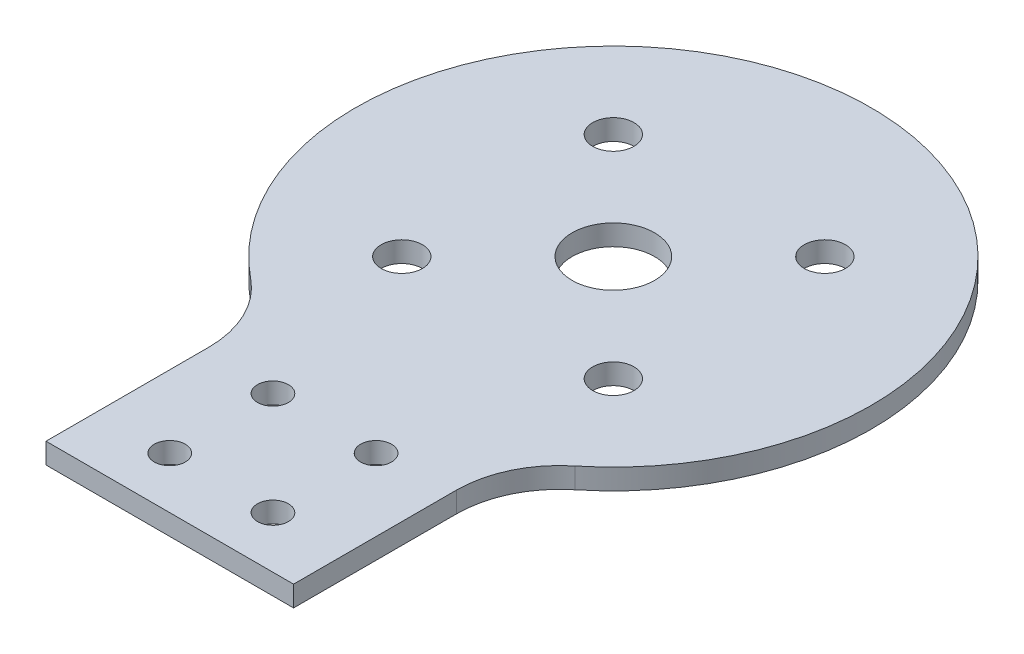
ISO-10303-21;
HEADER;
FILE_DESCRIPTION(('STEP AP214'),'2;1');
FILE_NAME('part.step','',(''),(''),'','','');
FILE_SCHEMA(('AUTOMOTIVE_DESIGN { 1 0 10303 214 1 1 1 1 }'));
ENDSEC;
DATA;
#1=APPLICATION_CONTEXT('core data for automotive mechanical design processes');
#2=APPLICATION_PROTOCOL_DEFINITION('international standard','automotive_design',2000,#1);
#3=PRODUCT_CONTEXT('',#1,'mechanical');
#4=PRODUCT('Part','Part','',(#3));
#5=PRODUCT_RELATED_PRODUCT_CATEGORY('part','',(#4));
#6=PRODUCT_DEFINITION_FORMATION('','',#4);
#7=PRODUCT_DEFINITION_CONTEXT('part definition',#1,'design');
#8=PRODUCT_DEFINITION('design','',#6,#7);
#9=PRODUCT_DEFINITION_SHAPE('','',#8);
#10=(LENGTH_UNIT() NAMED_UNIT(*) SI_UNIT(.MILLI.,.METRE.));
#11=(NAMED_UNIT(*) PLANE_ANGLE_UNIT() SI_UNIT($,.RADIAN.));
#12=(NAMED_UNIT(*) SI_UNIT($,.STERADIAN.) SOLID_ANGLE_UNIT());
#13=UNCERTAINTY_MEASURE_WITH_UNIT(LENGTH_MEASURE(1.E-05),#10,'distance_accuracy_value','');
#14=(GEOMETRIC_REPRESENTATION_CONTEXT(3) GLOBAL_UNCERTAINTY_ASSIGNED_CONTEXT((#13)) GLOBAL_UNIT_ASSIGNED_CONTEXT((#10,
#11,#12)) REPRESENTATION_CONTEXT('',''));
#15=CARTESIAN_POINT('',(0.,0.,0.));
#16=DIRECTION('',(0.,0.,1.));
#17=DIRECTION('',(1.,0.,0.));
#18=AXIS2_PLACEMENT_3D('',#15,#16,#17);
#19=CARTESIAN_POINT('',(0.,2.,0.));
#20=DIRECTION('',(0.,1.,0.));
#21=DIRECTION('',(0.,0.,1.));
#22=AXIS2_PLACEMENT_3D('',#19,#20,#21);
#23=PLANE('',#22);
#24=CARTESIAN_POINT('',(5.,2.,38.));
#25=DIRECTION('',(0.,1.,0.));
#26=DIRECTION('',(0.,0.,1.));
#27=AXIS2_PLACEMENT_3D('',#24,#25,#26);
#28=CIRCLE('',#27,1.5);
#29=CARTESIAN_POINT('',(5.,2.,39.5));
#30=VERTEX_POINT('',#29);
#31=EDGE_CURVE('E295',#30,#30,#28,.T.);
#32=ORIENTED_EDGE('',*,*,#31,.F.);
#33=EDGE_LOOP('',(#32));
#34=FACE_BOUND('',#33,.T.);
#35=CARTESIAN_POINT('',(-5.,2.,28.));
#36=DIRECTION('',(0.,1.,0.));
#37=DIRECTION('',(0.,0.,1.));
#38=AXIS2_PLACEMENT_3D('',#35,#36,#37);
#39=CIRCLE('',#38,1.5);
#40=CARTESIAN_POINT('',(-5.,2.,29.5));
#41=VERTEX_POINT('',#40);
#42=EDGE_CURVE('E291',#41,#41,#39,.T.);
#43=ORIENTED_EDGE('',*,*,#42,.F.);
#44=EDGE_LOOP('',(#43));
#45=FACE_BOUND('',#44,.T.);
#46=CARTESIAN_POINT('',(-5.,2.,38.));
#47=DIRECTION('',(0.,1.,0.));
#48=DIRECTION('',(0.,0.,1.));
#49=AXIS2_PLACEMENT_3D('',#46,#47,#48);
#50=CIRCLE('',#49,1.5);
#51=CARTESIAN_POINT('',(-5.,2.,39.5));
#52=VERTEX_POINT('',#51);
#53=EDGE_CURVE('E283',#52,#52,#50,.T.);
#54=ORIENTED_EDGE('',*,*,#53,.F.);
#55=EDGE_LOOP('',(#54));
#56=FACE_BOUND('',#55,.T.);
#57=CARTESIAN_POINT('',(5.,2.,28.));
#58=DIRECTION('',(0.,1.,0.));
#59=DIRECTION('',(0.,0.,1.));
#60=AXIS2_PLACEMENT_3D('',#57,#58,#59);
#61=CIRCLE('',#60,1.5);
#62=CARTESIAN_POINT('',(5.,2.,29.5));
#63=VERTEX_POINT('',#62);
#64=EDGE_CURVE('E299',#63,#63,#61,.T.);
#65=ORIENTED_EDGE('',*,*,#64,.F.);
#66=EDGE_LOOP('',(#65));
#67=FACE_BOUND('',#66,.T.);
#68=DIRECTION('',(0.,0.,-1.));
#69=VECTOR('',#68,1.);
#70=CARTESIAN_POINT('',(12.,2.,43.));
#71=LINE('',#70,#69);
#72=CARTESIAN_POINT('',(12.,2.,43.));
#73=VERTEX_POINT('',#72);
#74=CARTESIAN_POINT('',(12.,2.,27.2213151776324));
#75=VERTEX_POINT('',#74);
#76=EDGE_CURVE('E124',#73,#75,#71,.T.);
#77=ORIENTED_EDGE('',*,*,#76,.T.);
#78=CARTESIAN_POINT('',(22.,2.,27.2213151776324));
#79=DIRECTION('',(0.,1.,0.));
#80=DIRECTION('',(0.,0.,1.));
#81=AXIS2_PLACEMENT_3D('',#78,#79,#80);
#82=CIRCLE('',#81,10.);
#83=CARTESIAN_POINT('',(15.7142857142857,2.,19.4437965554517));
#84=VERTEX_POINT('',#83);
#85=EDGE_CURVE('E196',#75,#84,#82,.F.);
#86=ORIENTED_EDGE('',*,*,#85,.T.);
#87=CARTESIAN_POINT('',(0.,2.,0.));
#88=DIRECTION('',(0.,1.,0.));
#89=DIRECTION('',(0.,0.,1.));
#90=AXIS2_PLACEMENT_3D('',#87,#88,#89);
#91=CIRCLE('',#90,25.);
#92=CARTESIAN_POINT('',(-15.7142857142857,2.,19.4437965554517));
#93=VERTEX_POINT('',#92);
#94=EDGE_CURVE('E165',#84,#93,#91,.T.);
#95=ORIENTED_EDGE('',*,*,#94,.T.);
#96=CARTESIAN_POINT('',(-22.,2.,27.2213151776324));
#97=DIRECTION('',(0.,1.,0.));
#98=DIRECTION('',(0.,0.,1.));
#99=AXIS2_PLACEMENT_3D('',#96,#97,#98);
#100=CIRCLE('',#99,10.);
#101=CARTESIAN_POINT('',(-12.,2.,27.2213151776324));
#102=VERTEX_POINT('',#101);
#103=EDGE_CURVE('E54',#93,#102,#100,.F.);
#104=ORIENTED_EDGE('',*,*,#103,.T.);
#105=DIRECTION('',(0.,0.,1.));
#106=VECTOR('',#105,1.);
#107=CARTESIAN_POINT('',(-12.,2.,21.9317121994613));
#108=LINE('',#107,#106);
#109=CARTESIAN_POINT('',(-12.,2.,43.));
#110=VERTEX_POINT('',#109);
#111=EDGE_CURVE('E128',#102,#110,#108,.T.);
#112=ORIENTED_EDGE('',*,*,#111,.T.);
#113=DIRECTION('',(1.,0.,0.));
#114=VECTOR('',#113,1.);
#115=CARTESIAN_POINT('',(-12.,2.,43.));
#116=LINE('',#115,#114);
#117=EDGE_CURVE('E111',#110,#73,#116,.T.);
#118=ORIENTED_EDGE('',*,*,#117,.T.);
#119=EDGE_LOOP('',(#77,#86,#95,#104,#112,#118));
#120=FACE_BOUND('',#119,.T.);
#121=CARTESIAN_POINT('',(10.2530483272049,2.,10.2530483272049));
#122=DIRECTION('',(0.,1.,0.));
#123=DIRECTION('',(0.,0.,1.));
#124=AXIS2_PLACEMENT_3D('',#121,#122,#123);
#125=CIRCLE('',#124,2.);
#126=CARTESIAN_POINT('',(10.2530483272049,2.,12.2530483272049));
#127=VERTEX_POINT('',#126);
#128=EDGE_CURVE('E135',#127,#127,#125,.T.);
#129=ORIENTED_EDGE('',*,*,#128,.F.);
#130=EDGE_LOOP('',(#129));
#131=FACE_BOUND('',#130,.T.);
#132=CARTESIAN_POINT('',(-10.2530483272049,2.,10.2530483272049));
#133=DIRECTION('',(0.,1.,0.));
#134=DIRECTION('',(0.,0.,1.));
#135=AXIS2_PLACEMENT_3D('',#132,#133,#134);
#136=CIRCLE('',#135,2.);
#137=CARTESIAN_POINT('',(-10.2530483272049,2.,12.2530483272049));
#138=VERTEX_POINT('',#137);
#139=EDGE_CURVE('E141',#138,#138,#136,.T.);
#140=ORIENTED_EDGE('',*,*,#139,.F.);
#141=EDGE_LOOP('',(#140));
#142=FACE_BOUND('',#141,.T.);
#143=CARTESIAN_POINT('',(10.2530483272049,2.,-10.2530483272049));
#144=DIRECTION('',(0.,1.,0.));
#145=DIRECTION('',(0.,0.,1.));
#146=AXIS2_PLACEMENT_3D('',#143,#144,#145);
#147=CIRCLE('',#146,2.);
#148=CARTESIAN_POINT('',(10.2530483272049,2.,-8.25304832720494));
#149=VERTEX_POINT('',#148);
#150=EDGE_CURVE('E149',#149,#149,#147,.T.);
#151=ORIENTED_EDGE('',*,*,#150,.F.);
#152=EDGE_LOOP('',(#151));
#153=FACE_BOUND('',#152,.T.);
#154=CARTESIAN_POINT('',(-10.2530483272049,2.,-10.2530483272049));
#155=DIRECTION('',(0.,1.,0.));
#156=DIRECTION('',(0.,0.,1.));
#157=AXIS2_PLACEMENT_3D('',#154,#155,#156);
#158=CIRCLE('',#157,2.);
#159=CARTESIAN_POINT('',(-10.2530483272049,2.,-8.25304832720495));
#160=VERTEX_POINT('',#159);
#161=EDGE_CURVE('E157',#160,#160,#158,.T.);
#162=ORIENTED_EDGE('',*,*,#161,.F.);
#163=EDGE_LOOP('',(#162));
#164=FACE_BOUND('',#163,.T.);
#165=CARTESIAN_POINT('',(0.,2.,0.));
#166=DIRECTION('',(0.,1.,0.));
#167=DIRECTION('',(0.,0.,1.));
#168=AXIS2_PLACEMENT_3D('',#165,#166,#167);
#169=CIRCLE('',#168,4.);
#170=CARTESIAN_POINT('',(0.,2.,4.));
#171=VERTEX_POINT('',#170);
#172=EDGE_CURVE('E176',#171,#171,#169,.T.);
#173=ORIENTED_EDGE('',*,*,#172,.F.);
#174=EDGE_LOOP('',(#173));
#175=FACE_BOUND('',#174,.T.);
#176=ADVANCED_FACE('F45',(#34,#45,#56,#67,#120,#131,#142,#153,#164,#175),#23,.T.);
#177=CARTESIAN_POINT('',(0.,0.,0.));
#178=DIRECTION('',(0.,1.,0.));
#179=DIRECTION('',(0.,0.,1.));
#180=AXIS2_PLACEMENT_3D('',#177,#178,#179);
#181=PLANE('',#180);
#182=CARTESIAN_POINT('',(5.,0.,38.));
#183=DIRECTION('',(0.,1.,0.));
#184=DIRECTION('',(0.,0.,1.));
#185=AXIS2_PLACEMENT_3D('',#182,#183,#184);
#186=CIRCLE('',#185,1.5);
#187=CARTESIAN_POINT('',(5.,0.,39.5));
#188=VERTEX_POINT('',#187);
#189=EDGE_CURVE('E300',#188,#188,#186,.T.);
#190=ORIENTED_EDGE('',*,*,#189,.T.);
#191=EDGE_LOOP('',(#190));
#192=FACE_BOUND('',#191,.T.);
#193=CARTESIAN_POINT('',(-5.,0.,28.));
#194=DIRECTION('',(0.,1.,0.));
#195=DIRECTION('',(0.,0.,1.));
#196=AXIS2_PLACEMENT_3D('',#193,#194,#195);
#197=CIRCLE('',#196,1.5);
#198=CARTESIAN_POINT('',(-5.,0.,29.5));
#199=VERTEX_POINT('',#198);
#200=EDGE_CURVE('E286',#199,#199,#197,.T.);
#201=ORIENTED_EDGE('',*,*,#200,.T.);
#202=EDGE_LOOP('',(#201));
#203=FACE_BOUND('',#202,.T.);
#204=CARTESIAN_POINT('',(-5.,0.,38.));
#205=DIRECTION('',(0.,1.,0.));
#206=DIRECTION('',(0.,0.,1.));
#207=AXIS2_PLACEMENT_3D('',#204,#205,#206);
#208=CIRCLE('',#207,1.5);
#209=CARTESIAN_POINT('',(-5.,0.,39.5));
#210=VERTEX_POINT('',#209);
#211=EDGE_CURVE('E280',#210,#210,#208,.T.);
#212=ORIENTED_EDGE('',*,*,#211,.T.);
#213=EDGE_LOOP('',(#212));
#214=FACE_BOUND('',#213,.T.);
#215=CARTESIAN_POINT('',(5.,0.,28.));
#216=DIRECTION('',(0.,1.,0.));
#217=DIRECTION('',(0.,0.,1.));
#218=AXIS2_PLACEMENT_3D('',#215,#216,#217);
#219=CIRCLE('',#218,1.5);
#220=CARTESIAN_POINT('',(5.,0.,29.5));
#221=VERTEX_POINT('',#220);
#222=EDGE_CURVE('E129',#221,#221,#219,.T.);
#223=ORIENTED_EDGE('',*,*,#222,.T.);
#224=EDGE_LOOP('',(#223));
#225=FACE_BOUND('',#224,.T.);
#226=CARTESIAN_POINT('',(10.2530483272049,0.,10.2530483272049));
#227=DIRECTION('',(0.,1.,0.));
#228=DIRECTION('',(0.,0.,1.));
#229=AXIS2_PLACEMENT_3D('',#226,#227,#228);
#230=CIRCLE('',#229,2.);
#231=CARTESIAN_POINT('',(10.2530483272049,0.,12.2530483272049));
#232=VERTEX_POINT('',#231);
#233=EDGE_CURVE('E137',#232,#232,#230,.T.);
#234=ORIENTED_EDGE('',*,*,#233,.T.);
#235=EDGE_LOOP('',(#234));
#236=FACE_BOUND('',#235,.T.);
#237=CARTESIAN_POINT('',(-10.2530483272049,0.,10.2530483272049));
#238=DIRECTION('',(0.,1.,0.));
#239=DIRECTION('',(0.,0.,1.));
#240=AXIS2_PLACEMENT_3D('',#237,#238,#239);
#241=CIRCLE('',#240,2.);
#242=CARTESIAN_POINT('',(-10.2530483272049,0.,12.2530483272049));
#243=VERTEX_POINT('',#242);
#244=EDGE_CURVE('E145',#243,#243,#241,.T.);
#245=ORIENTED_EDGE('',*,*,#244,.T.);
#246=EDGE_LOOP('',(#245));
#247=FACE_BOUND('',#246,.T.);
#248=CARTESIAN_POINT('',(10.2530483272049,0.,-10.2530483272049));
#249=DIRECTION('',(0.,1.,0.));
#250=DIRECTION('',(0.,0.,1.));
#251=AXIS2_PLACEMENT_3D('',#248,#249,#250);
#252=CIRCLE('',#251,2.);
#253=CARTESIAN_POINT('',(10.2530483272049,0.,-8.25304832720494));
#254=VERTEX_POINT('',#253);
#255=EDGE_CURVE('E153',#254,#254,#252,.T.);
#256=ORIENTED_EDGE('',*,*,#255,.T.);
#257=EDGE_LOOP('',(#256));
#258=FACE_BOUND('',#257,.T.);
#259=CARTESIAN_POINT('',(-10.2530483272049,0.,-10.2530483272049));
#260=DIRECTION('',(0.,1.,0.));
#261=DIRECTION('',(0.,0.,1.));
#262=AXIS2_PLACEMENT_3D('',#259,#260,#261);
#263=CIRCLE('',#262,2.);
#264=CARTESIAN_POINT('',(-10.2530483272049,0.,-8.25304832720495));
#265=VERTEX_POINT('',#264);
#266=EDGE_CURVE('E161',#265,#265,#263,.T.);
#267=ORIENTED_EDGE('',*,*,#266,.T.);
#268=EDGE_LOOP('',(#267));
#269=FACE_BOUND('',#268,.T.);
#270=CARTESIAN_POINT('',(0.,0.,0.));
#271=DIRECTION('',(0.,1.,0.));
#272=DIRECTION('',(0.,0.,1.));
#273=AXIS2_PLACEMENT_3D('',#270,#271,#272);
#274=CIRCLE('',#273,25.);
#275=CARTESIAN_POINT('',(15.7142857142857,0.,19.4437965554517));
#276=VERTEX_POINT('',#275);
#277=CARTESIAN_POINT('',(-15.7142857142857,0.,19.4437965554517));
#278=VERTEX_POINT('',#277);
#279=EDGE_CURVE('E169',#276,#278,#274,.T.);
#280=ORIENTED_EDGE('',*,*,#279,.F.);
#281=CARTESIAN_POINT('',(22.,0.,27.2213151776324));
#282=DIRECTION('',(0.,1.,0.));
#283=DIRECTION('',(0.,0.,1.));
#284=AXIS2_PLACEMENT_3D('',#281,#282,#283);
#285=CIRCLE('',#284,10.);
#286=CARTESIAN_POINT('',(12.,0.,27.2213151776324));
#287=VERTEX_POINT('',#286);
#288=EDGE_CURVE('E199',#276,#287,#285,.T.);
#289=ORIENTED_EDGE('',*,*,#288,.T.);
#290=DIRECTION('',(0.,0.,-1.));
#291=VECTOR('',#290,1.);
#292=CARTESIAN_POINT('',(12.,0.,43.));
#293=LINE('',#292,#291);
#294=CARTESIAN_POINT('',(12.,0.,43.));
#295=VERTEX_POINT('',#294);
#296=EDGE_CURVE('E105',#295,#287,#293,.T.);
#297=ORIENTED_EDGE('',*,*,#296,.F.);
#298=DIRECTION('',(1.,0.,0.));
#299=VECTOR('',#298,1.);
#300=CARTESIAN_POINT('',(-12.,0.,43.));
#301=LINE('',#300,#299);
#302=CARTESIAN_POINT('',(-12.,0.,43.));
#303=VERTEX_POINT('',#302);
#304=EDGE_CURVE('E104',#303,#295,#301,.T.);
#305=ORIENTED_EDGE('',*,*,#304,.F.);
#306=DIRECTION('',(0.,0.,1.));
#307=VECTOR('',#306,1.);
#308=CARTESIAN_POINT('',(-12.,0.,21.9317121994613));
#309=LINE('',#308,#307);
#310=CARTESIAN_POINT('',(-12.,0.,27.2213151776324));
#311=VERTEX_POINT('',#310);
#312=EDGE_CURVE('E95',#311,#303,#309,.T.);
#313=ORIENTED_EDGE('',*,*,#312,.F.);
#314=CARTESIAN_POINT('',(-22.,0.,27.2213151776324));
#315=DIRECTION('',(0.,1.,0.));
#316=DIRECTION('',(0.,0.,1.));
#317=AXIS2_PLACEMENT_3D('',#314,#315,#316);
#318=CIRCLE('',#317,10.);
#319=EDGE_CURVE('E11',#311,#278,#318,.T.);
#320=ORIENTED_EDGE('',*,*,#319,.T.);
#321=EDGE_LOOP('',(#280,#289,#297,#305,#313,#320));
#322=FACE_BOUND('',#321,.T.);
#323=CARTESIAN_POINT('',(0.,0.,0.));
#324=DIRECTION('',(0.,1.,0.));
#325=DIRECTION('',(0.,0.,1.));
#326=AXIS2_PLACEMENT_3D('',#323,#324,#325);
#327=CIRCLE('',#326,4.);
#328=CARTESIAN_POINT('',(0.,0.,4.));
#329=VERTEX_POINT('',#328);
#330=EDGE_CURVE('E173',#329,#329,#327,.T.);
#331=ORIENTED_EDGE('',*,*,#330,.T.);
#332=EDGE_LOOP('',(#331));
#333=FACE_BOUND('',#332,.T.);
#334=ADVANCED_FACE('F117',(#192,#203,#214,#225,#236,#247,#258,#269,#322,#333),#181,.F.);
#335=CARTESIAN_POINT('',(0.,2.,0.));
#336=DIRECTION('',(0.,-1.,0.));
#337=DIRECTION('',(0.,0.,-1.));
#338=AXIS2_PLACEMENT_3D('',#335,#336,#337);
#339=CYLINDRICAL_SURFACE('',#338,4.);
#340=ORIENTED_EDGE('',*,*,#172,.T.);
#341=EDGE_LOOP('',(#340));
#342=FACE_BOUND('',#341,.T.);
#343=ORIENTED_EDGE('',*,*,#330,.F.);
#344=EDGE_LOOP('',(#343));
#345=FACE_BOUND('',#344,.T.);
#346=ADVANCED_FACE('F229',(#342,#345),#339,.F.);
#347=CARTESIAN_POINT('',(0.,0.,0.));
#348=DIRECTION('',(0.,1.,0.));
#349=DIRECTION('',(0.,0.,1.));
#350=AXIS2_PLACEMENT_3D('',#347,#348,#349);
#351=CYLINDRICAL_SURFACE('',#350,25.);
#352=ORIENTED_EDGE('',*,*,#94,.F.);
#353=DIRECTION('',(0.,1.,0.));
#354=VECTOR('',#353,1.);
#355=CARTESIAN_POINT('',(15.7142857142857,0.,19.4437965554517));
#356=LINE('',#355,#354);
#357=EDGE_CURVE('E191',#84,#276,#356,.F.);
#358=ORIENTED_EDGE('',*,*,#357,.T.);
#359=ORIENTED_EDGE('',*,*,#279,.T.);
#360=DIRECTION('',(0.,1.,0.));
#361=VECTOR('',#360,1.);
#362=CARTESIAN_POINT('',(-15.7142857142857,0.,19.4437965554517));
#363=LINE('',#362,#361);
#364=EDGE_CURVE('E187',#278,#93,#363,.T.);
#365=ORIENTED_EDGE('',*,*,#364,.T.);
#366=EDGE_LOOP('',(#352,#358,#359,#365));
#367=FACE_BOUND('',#366,.T.);
#368=ADVANCED_FACE('F214',(#367),#351,.T.);
#369=CARTESIAN_POINT('',(-10.2530483272049,0.,-10.2530483272049));
#370=DIRECTION('',(0.,1.,0.));
#371=DIRECTION('',(0.,0.,1.));
#372=AXIS2_PLACEMENT_3D('',#369,#370,#371);
#373=CYLINDRICAL_SURFACE('',#372,2.);
#374=ORIENTED_EDGE('',*,*,#266,.F.);
#375=EDGE_LOOP('',(#374));
#376=FACE_BOUND('',#375,.T.);
#377=ORIENTED_EDGE('',*,*,#161,.T.);
#378=EDGE_LOOP('',(#377));
#379=FACE_BOUND('',#378,.T.);
#380=ADVANCED_FACE('F240',(#376,#379),#373,.F.);
#381=CARTESIAN_POINT('',(10.2530483272049,0.,-10.2530483272049));
#382=DIRECTION('',(0.,1.,0.));
#383=DIRECTION('',(0.,0.,1.));
#384=AXIS2_PLACEMENT_3D('',#381,#382,#383);
#385=CYLINDRICAL_SURFACE('',#384,2.);
#386=ORIENTED_EDGE('',*,*,#255,.F.);
#387=EDGE_LOOP('',(#386));
#388=FACE_BOUND('',#387,.T.);
#389=ORIENTED_EDGE('',*,*,#150,.T.);
#390=EDGE_LOOP('',(#389));
#391=FACE_BOUND('',#390,.T.);
#392=ADVANCED_FACE('F243',(#388,#391),#385,.F.);
#393=CARTESIAN_POINT('',(-10.2530483272049,0.,10.2530483272049));
#394=DIRECTION('',(0.,1.,0.));
#395=DIRECTION('',(0.,0.,1.));
#396=AXIS2_PLACEMENT_3D('',#393,#394,#395);
#397=CYLINDRICAL_SURFACE('',#396,2.);
#398=ORIENTED_EDGE('',*,*,#244,.F.);
#399=EDGE_LOOP('',(#398));
#400=FACE_BOUND('',#399,.T.);
#401=ORIENTED_EDGE('',*,*,#139,.T.);
#402=EDGE_LOOP('',(#401));
#403=FACE_BOUND('',#402,.T.);
#404=ADVANCED_FACE('F247',(#400,#403),#397,.F.);
#405=CARTESIAN_POINT('',(10.2530483272049,0.,10.2530483272049));
#406=DIRECTION('',(0.,1.,0.));
#407=DIRECTION('',(0.,0.,1.));
#408=AXIS2_PLACEMENT_3D('',#405,#406,#407);
#409=CYLINDRICAL_SURFACE('',#408,2.);
#410=ORIENTED_EDGE('',*,*,#233,.F.);
#411=EDGE_LOOP('',(#410));
#412=FACE_BOUND('',#411,.T.);
#413=ORIENTED_EDGE('',*,*,#128,.T.);
#414=EDGE_LOOP('',(#413));
#415=FACE_BOUND('',#414,.T.);
#416=ADVANCED_FACE('F251',(#412,#415),#409,.F.);
#417=CARTESIAN_POINT('',(12.,0.,43.));
#418=DIRECTION('',(1.,0.,0.));
#419=DIRECTION('',(0.,0.,-1.));
#420=AXIS2_PLACEMENT_3D('',#417,#418,#419);
#421=PLANE('',#420);
#422=ORIENTED_EDGE('',*,*,#296,.T.);
#423=DIRECTION('',(0.,-1.,0.));
#424=VECTOR('',#423,1.);
#425=CARTESIAN_POINT('',(12.,2.,27.2213151776324));
#426=LINE('',#425,#424);
#427=EDGE_CURVE('E180',#287,#75,#426,.F.);
#428=ORIENTED_EDGE('',*,*,#427,.T.);
#429=ORIENTED_EDGE('',*,*,#76,.F.);
#430=DIRECTION('',(0.,1.,0.));
#431=VECTOR('',#430,1.);
#432=CARTESIAN_POINT('',(12.,0.,43.));
#433=LINE('',#432,#431);
#434=EDGE_CURVE('E113',#295,#73,#433,.T.);
#435=ORIENTED_EDGE('',*,*,#434,.F.);
#436=EDGE_LOOP('',(#422,#428,#429,#435));
#437=FACE_BOUND('',#436,.T.);
#438=ADVANCED_FACE('F207',(#437),#421,.T.);
#439=CARTESIAN_POINT('',(-12.,0.,43.));
#440=DIRECTION('',(0.,0.,1.));
#441=DIRECTION('',(1.,0.,0.));
#442=AXIS2_PLACEMENT_3D('',#439,#440,#441);
#443=PLANE('',#442);
#444=ORIENTED_EDGE('',*,*,#117,.F.);
#445=DIRECTION('',(0.,1.,0.));
#446=VECTOR('',#445,1.);
#447=CARTESIAN_POINT('',(-12.,0.,43.));
#448=LINE('',#447,#446);
#449=EDGE_CURVE('E98',#303,#110,#448,.T.);
#450=ORIENTED_EDGE('',*,*,#449,.F.);
#451=ORIENTED_EDGE('',*,*,#304,.T.);
#452=ORIENTED_EDGE('',*,*,#434,.T.);
#453=EDGE_LOOP('',(#444,#450,#451,#452));
#454=FACE_BOUND('',#453,.T.);
#455=ADVANCED_FACE('F109',(#454),#443,.T.);
#456=CARTESIAN_POINT('',(-12.,0.,21.9317121994613));
#457=DIRECTION('',(-1.,0.,0.));
#458=DIRECTION('',(0.,0.,1.));
#459=AXIS2_PLACEMENT_3D('',#456,#457,#458);
#460=PLANE('',#459);
#461=ORIENTED_EDGE('',*,*,#111,.F.);
#462=DIRECTION('',(0.,-1.,0.));
#463=VECTOR('',#462,1.);
#464=CARTESIAN_POINT('',(-12.,0.,27.2213151776324));
#465=LINE('',#464,#463);
#466=EDGE_CURVE('E61',#102,#311,#465,.T.);
#467=ORIENTED_EDGE('',*,*,#466,.T.);
#468=ORIENTED_EDGE('',*,*,#312,.T.);
#469=ORIENTED_EDGE('',*,*,#449,.T.);
#470=EDGE_LOOP('',(#461,#467,#468,#469));
#471=FACE_BOUND('',#470,.T.);
#472=ADVANCED_FACE('F97',(#471),#460,.T.);
#473=CARTESIAN_POINT('',(5.,0.,28.));
#474=DIRECTION('',(0.,1.,0.));
#475=DIRECTION('',(0.,0.,1.));
#476=AXIS2_PLACEMENT_3D('',#473,#474,#475);
#477=CYLINDRICAL_SURFACE('',#476,1.5);
#478=ORIENTED_EDGE('',*,*,#222,.F.);
#479=EDGE_LOOP('',(#478));
#480=FACE_BOUND('',#479,.T.);
#481=ORIENTED_EDGE('',*,*,#64,.T.);
#482=EDGE_LOOP('',(#481));
#483=FACE_BOUND('',#482,.T.);
#484=ADVANCED_FACE('F260',(#480,#483),#477,.F.);
#485=CARTESIAN_POINT('',(-5.,0.,38.));
#486=DIRECTION('',(0.,1.,0.));
#487=DIRECTION('',(0.,0.,1.));
#488=AXIS2_PLACEMENT_3D('',#485,#486,#487);
#489=CYLINDRICAL_SURFACE('',#488,1.5);
#490=ORIENTED_EDGE('',*,*,#211,.F.);
#491=EDGE_LOOP('',(#490));
#492=FACE_BOUND('',#491,.T.);
#493=ORIENTED_EDGE('',*,*,#53,.T.);
#494=EDGE_LOOP('',(#493));
#495=FACE_BOUND('',#494,.T.);
#496=ADVANCED_FACE('F265',(#492,#495),#489,.F.);
#497=CARTESIAN_POINT('',(-5.,0.,28.));
#498=DIRECTION('',(0.,1.,0.));
#499=DIRECTION('',(0.,0.,1.));
#500=AXIS2_PLACEMENT_3D('',#497,#498,#499);
#501=CYLINDRICAL_SURFACE('',#500,1.5);
#502=ORIENTED_EDGE('',*,*,#200,.F.);
#503=EDGE_LOOP('',(#502));
#504=FACE_BOUND('',#503,.T.);
#505=ORIENTED_EDGE('',*,*,#42,.T.);
#506=EDGE_LOOP('',(#505));
#507=FACE_BOUND('',#506,.T.);
#508=ADVANCED_FACE('F267',(#504,#507),#501,.F.);
#509=CARTESIAN_POINT('',(5.,0.,38.));
#510=DIRECTION('',(0.,1.,0.));
#511=DIRECTION('',(0.,0.,1.));
#512=AXIS2_PLACEMENT_3D('',#509,#510,#511);
#513=CYLINDRICAL_SURFACE('',#512,1.5);
#514=ORIENTED_EDGE('',*,*,#189,.F.);
#515=EDGE_LOOP('',(#514));
#516=FACE_BOUND('',#515,.T.);
#517=ORIENTED_EDGE('',*,*,#31,.T.);
#518=EDGE_LOOP('',(#517));
#519=FACE_BOUND('',#518,.T.);
#520=ADVANCED_FACE('F221',(#516,#519),#513,.F.);
#521=CARTESIAN_POINT('',(22.,0.,27.2213151776324));
#522=DIRECTION('',(0.,1.,0.));
#523=DIRECTION('',(0.,0.,1.));
#524=AXIS2_PLACEMENT_3D('',#521,#522,#523);
#525=CYLINDRICAL_SURFACE('',#524,10.);
#526=ORIENTED_EDGE('',*,*,#288,.F.);
#527=ORIENTED_EDGE('',*,*,#357,.F.);
#528=ORIENTED_EDGE('',*,*,#85,.F.);
#529=ORIENTED_EDGE('',*,*,#427,.F.);
#530=EDGE_LOOP('',(#526,#527,#528,#529));
#531=FACE_BOUND('',#530,.T.);
#532=ADVANCED_FACE('F210',(#531),#525,.F.);
#533=CARTESIAN_POINT('',(-22.,0.,27.2213151776324));
#534=DIRECTION('',(0.,1.,0.));
#535=DIRECTION('',(0.,0.,1.));
#536=AXIS2_PLACEMENT_3D('',#533,#534,#535);
#537=CYLINDRICAL_SURFACE('',#536,10.);
#538=ORIENTED_EDGE('',*,*,#319,.F.);
#539=ORIENTED_EDGE('',*,*,#466,.F.);
#540=ORIENTED_EDGE('',*,*,#103,.F.);
#541=ORIENTED_EDGE('',*,*,#364,.F.);
#542=EDGE_LOOP('',(#538,#539,#540,#541));
#543=FACE_BOUND('',#542,.T.);
#544=ADVANCED_FACE('F47',(#543),#537,.F.);
#545=CLOSED_SHELL('',(#176,#334,#346,#368,#380,#392,#404,#416,#438,#455,#472,#484,#496,#508,
#520,#532,#544));
#546=MANIFOLD_SOLID_BREP('B2',#545);
#547=ADVANCED_BREP_SHAPE_REPRESENTATION('',(#18,#546),#14);
#548=SHAPE_DEFINITION_REPRESENTATION(#9,#547);
ENDSEC;
END-ISO-10303-21;
